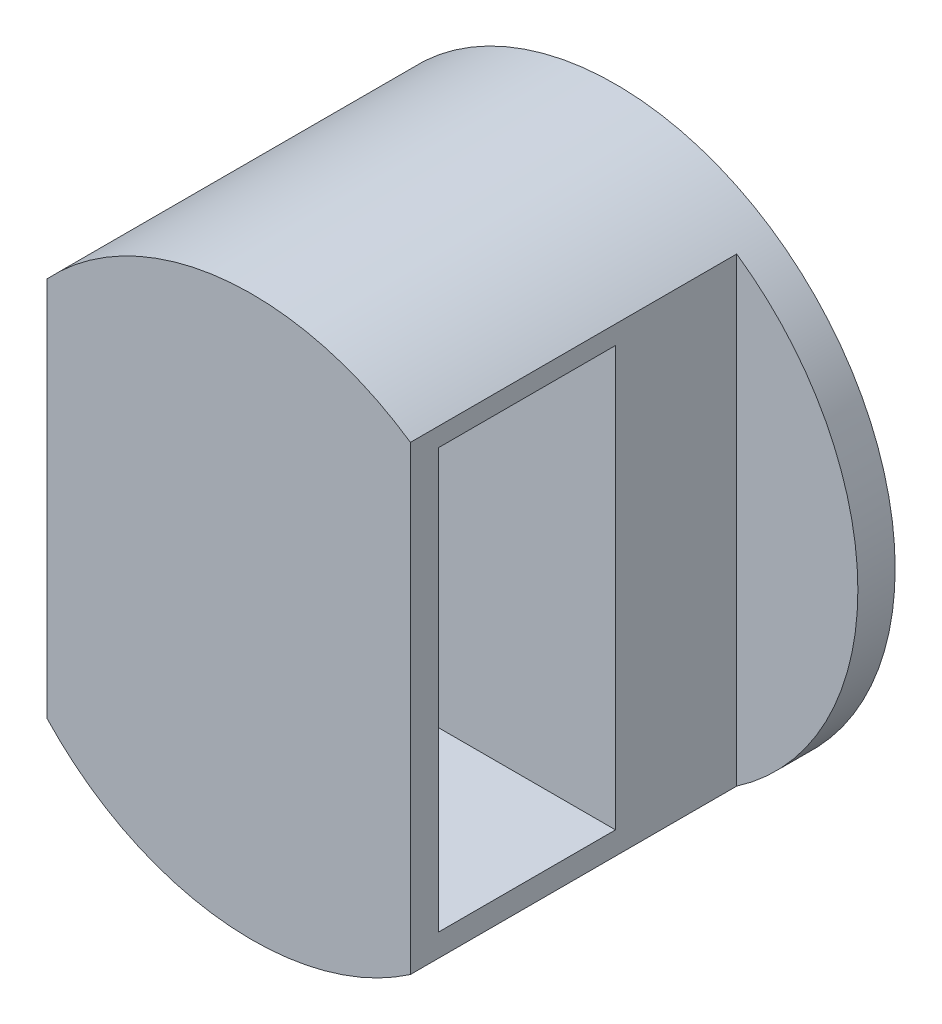
ISO-10303-21;
HEADER;
FILE_DESCRIPTION(('STEP AP214'),'2;1');
FILE_NAME('part.step','',(''),(''),'','','');
FILE_SCHEMA(('AUTOMOTIVE_DESIGN { 1 0 10303 214 1 1 1 1 }'));
ENDSEC;
DATA;
#1=APPLICATION_CONTEXT('core data for automotive mechanical design processes');
#2=APPLICATION_PROTOCOL_DEFINITION('international standard','automotive_design',2000,#1);
#3=PRODUCT_CONTEXT('',#1,'mechanical');
#4=PRODUCT('Part','Part','',(#3));
#5=PRODUCT_RELATED_PRODUCT_CATEGORY('part','',(#4));
#6=PRODUCT_DEFINITION_FORMATION('','',#4);
#7=PRODUCT_DEFINITION_CONTEXT('part definition',#1,'design');
#8=PRODUCT_DEFINITION('design','',#6,#7);
#9=PRODUCT_DEFINITION_SHAPE('','',#8);
#10=(LENGTH_UNIT() NAMED_UNIT(*) SI_UNIT(.MILLI.,.METRE.));
#11=(NAMED_UNIT(*) PLANE_ANGLE_UNIT() SI_UNIT($,.RADIAN.));
#12=(NAMED_UNIT(*) SI_UNIT($,.STERADIAN.) SOLID_ANGLE_UNIT());
#13=UNCERTAINTY_MEASURE_WITH_UNIT(LENGTH_MEASURE(1.E-05),#10,'distance_accuracy_value','');
#14=(GEOMETRIC_REPRESENTATION_CONTEXT(3) GLOBAL_UNCERTAINTY_ASSIGNED_CONTEXT((#13)) GLOBAL_UNIT_ASSIGNED_CONTEXT((#10,
#11,#12)) REPRESENTATION_CONTEXT('',''));
#15=CARTESIAN_POINT('',(0.,0.,0.));
#16=DIRECTION('',(0.,0.,1.));
#17=DIRECTION('',(1.,0.,0.));
#18=AXIS2_PLACEMENT_3D('',#15,#16,#17);
#19=CARTESIAN_POINT('',(-21.6771038039671,21.4882803297998,4.));
#20=DIRECTION('',(0.,0.,1.));
#21=DIRECTION('',(1.,0.,0.));
#22=AXIS2_PLACEMENT_3D('',#19,#20,#21);
#23=PLANE('',#22);
#24=CARTESIAN_POINT('',(-21.6771038039671,21.4882803297998,4.));
#25=DIRECTION('',(0.,0.,1.));
#26=DIRECTION('',(1.,0.,0.));
#27=AXIS2_PLACEMENT_3D('',#24,#25,#26);
#28=CIRCLE('',#27,30.);
#29=CARTESIAN_POINT('',(-43.6771038039671,41.8843583841709,4.));
#30=VERTEX_POINT('',#29);
#31=CARTESIAN_POINT('',(-43.6771038039671,1.09220227542863,4.));
#32=VERTEX_POINT('',#31);
#33=EDGE_CURVE('E11',#30,#32,#28,.T.);
#34=ORIENTED_EDGE('',*,*,#33,.T.);
#35=DIRECTION('',(0.,1.,0.));
#36=VECTOR('',#35,1.);
#37=CARTESIAN_POINT('',(-43.6771038039671,0.,4.));
#38=LINE('',#37,#36);
#39=EDGE_CURVE('E154',#32,#30,#38,.T.);
#40=ORIENTED_EDGE('',*,*,#39,.T.);
#41=EDGE_LOOP('',(#34,#40));
#42=FACE_BOUND('',#41,.T.);
#43=ADVANCED_FACE('F43',(#42),#23,.T.);
#44=CARTESIAN_POINT('',(-21.6771038039671,21.4882803297998,4.));
#45=DIRECTION('',(0.,0.,-1.));
#46=DIRECTION('',(-1.,0.,0.));
#47=AXIS2_PLACEMENT_3D('',#44,#45,#46);
#48=CYLINDRICAL_SURFACE('',#47,30.);
#49=ORIENTED_EDGE('',*,*,#33,.F.);
#50=DIRECTION('',(0.,0.,-1.));
#51=VECTOR('',#50,1.);
#52=CARTESIAN_POINT('',(-43.6771038039671,41.8843583841709,39.));
#53=LINE('',#52,#51);
#54=CARTESIAN_POINT('',(-43.6771038039671,41.8843583841709,39.));
#55=VERTEX_POINT('',#54);
#56=EDGE_CURVE('E165',#55,#30,#53,.T.);
#57=ORIENTED_EDGE('',*,*,#56,.F.);
#58=CARTESIAN_POINT('',(-21.6771038039671,21.4882803297998,39.));
#59=DIRECTION('',(0.,0.,1.));
#60=DIRECTION('',(1.,0.,0.));
#61=AXIS2_PLACEMENT_3D('',#58,#59,#60);
#62=CIRCLE('',#61,30.);
#63=CARTESIAN_POINT('',(-4.67710380396715,46.2066945184163,39.));
#64=VERTEX_POINT('',#63);
#65=EDGE_CURVE('E155',#64,#55,#62,.T.);
#66=ORIENTED_EDGE('',*,*,#65,.F.);
#67=DIRECTION('',(0.,0.,-1.));
#68=VECTOR('',#67,1.);
#69=CARTESIAN_POINT('',(-4.67710380396715,46.2066945184163,39.));
#70=LINE('',#69,#68);
#71=CARTESIAN_POINT('',(-4.67710380396715,46.2066945184163,4.));
#72=VERTEX_POINT('',#71);
#73=EDGE_CURVE('E168',#64,#72,#70,.T.);
#74=ORIENTED_EDGE('',*,*,#73,.T.);
#75=CARTESIAN_POINT('',(-4.67710380396714,-3.23013385881678,4.));
#76=VERTEX_POINT('',#75);
#77=EDGE_CURVE('E52',#76,#72,#28,.T.);
#78=ORIENTED_EDGE('',*,*,#77,.F.);
#79=DIRECTION('',(0.,0.,-1.));
#80=VECTOR('',#79,1.);
#81=CARTESIAN_POINT('',(-4.67710380396714,-3.23013385881678,39.));
#82=LINE('',#81,#80);
#83=CARTESIAN_POINT('',(-4.67710380396714,-3.23013385881678,39.));
#84=VERTEX_POINT('',#83);
#85=EDGE_CURVE('E171',#84,#76,#82,.T.);
#86=ORIENTED_EDGE('',*,*,#85,.F.);
#87=CARTESIAN_POINT('',(-43.6771038039671,1.09220227542863,39.));
#88=VERTEX_POINT('',#87);
#89=EDGE_CURVE('E150',#88,#84,#62,.T.);
#90=ORIENTED_EDGE('',*,*,#89,.F.);
#91=DIRECTION('',(0.,0.,-1.));
#92=VECTOR('',#91,1.);
#93=CARTESIAN_POINT('',(-43.6771038039671,1.09220227542863,39.));
#94=LINE('',#93,#92);
#95=EDGE_CURVE('E160',#88,#32,#94,.T.);
#96=ORIENTED_EDGE('',*,*,#95,.T.);
#97=EDGE_LOOP('',(#49,#57,#66,#74,#78,#86,#90,#96));
#98=FACE_BOUND('',#97,.T.);
#99=CARTESIAN_POINT('',(-21.6771038039671,21.4882803297998,0.));
#100=DIRECTION('',(0.,0.,1.));
#101=DIRECTION('',(1.,0.,0.));
#102=AXIS2_PLACEMENT_3D('',#99,#100,#101);
#103=CIRCLE('',#102,30.);
#104=CARTESIAN_POINT('',(8.32289619603285,21.4882803297998,0.));
#105=VERTEX_POINT('',#104);
#106=EDGE_CURVE('E47',#105,#105,#103,.T.);
#107=ORIENTED_EDGE('',*,*,#106,.T.);
#108=EDGE_LOOP('',(#107));
#109=FACE_BOUND('',#108,.T.);
#110=ADVANCED_FACE('F45',(#98,#109),#48,.T.);
#111=DIRECTION('',(0.,1.,0.));
#112=VECTOR('',#111,1.);
#113=CARTESIAN_POINT('',(-4.67710380396714,0.,4.));
#114=LINE('',#113,#112);
#115=EDGE_CURVE('E66',#76,#72,#114,.T.);
#116=ORIENTED_EDGE('',*,*,#115,.F.);
#117=ORIENTED_EDGE('',*,*,#77,.T.);
#118=EDGE_LOOP('',(#116,#117));
#119=FACE_BOUND('',#118,.T.);
#120=ADVANCED_FACE('F180',(#119),#23,.T.);
#121=CARTESIAN_POINT('',(-21.6771038039671,21.4882803297998,0.));
#122=DIRECTION('',(0.,0.,1.));
#123=DIRECTION('',(1.,0.,0.));
#124=AXIS2_PLACEMENT_3D('',#121,#122,#123);
#125=PLANE('',#124);
#126=CARTESIAN_POINT('',(-21.6771038039671,21.4882803297998,0.));
#127=DIRECTION('',(0.,0.,-1.));
#128=DIRECTION('',(-1.,0.,0.));
#129=AXIS2_PLACEMENT_3D('',#126,#127,#128);
#130=CIRCLE('',#129,1.00121044778746);
#131=CARTESIAN_POINT('',(-22.6783142517546,21.4882803297998,0.));
#132=VERTEX_POINT('',#131);
#133=EDGE_CURVE('E134',#132,#132,#130,.T.);
#134=ORIENTED_EDGE('',*,*,#133,.F.);
#135=EDGE_LOOP('',(#134));
#136=FACE_BOUND('',#135,.T.);
#137=ORIENTED_EDGE('',*,*,#106,.F.);
#138=EDGE_LOOP('',(#137));
#139=FACE_BOUND('',#138,.T.);
#140=ADVANCED_FACE('F177',(#136,#139),#125,.F.);
#141=CARTESIAN_POINT('',(-4.67710380396714,0.,39.));
#142=DIRECTION('',(-1.,0.,0.));
#143=DIRECTION('',(0.,-1.,0.));
#144=AXIS2_PLACEMENT_3D('',#141,#142,#143);
#145=PLANE('',#144);
#146=DIRECTION('',(0.,0.,-1.));
#147=VECTOR('',#146,1.);
#148=CARTESIAN_POINT('',(-4.67710380396714,-0.793305481583684,36.));
#149=LINE('',#148,#147);
#150=CARTESIAN_POINT('',(-4.67710380396714,-0.793305481583684,36.));
#151=VERTEX_POINT('',#150);
#152=CARTESIAN_POINT('',(-4.67710380396714,-0.793305481583684,17.));
#153=VERTEX_POINT('',#152);
#154=EDGE_CURVE('E140',#151,#153,#149,.T.);
#155=ORIENTED_EDGE('',*,*,#154,.F.);
#156=DIRECTION('',(0.,-1.,0.));
#157=VECTOR('',#156,1.);
#158=CARTESIAN_POINT('',(-4.67710380396715,44.2066945184163,36.));
#159=LINE('',#158,#157);
#160=CARTESIAN_POINT('',(-4.67710380396715,44.2066945184163,36.));
#161=VERTEX_POINT('',#160);
#162=EDGE_CURVE('E59',#161,#151,#159,.T.);
#163=ORIENTED_EDGE('',*,*,#162,.F.);
#164=DIRECTION('',(0.,0.,1.));
#165=VECTOR('',#164,1.);
#166=CARTESIAN_POINT('',(-4.67710380396715,44.2066945184163,36.));
#167=LINE('',#166,#165);
#168=CARTESIAN_POINT('',(-4.67710380396715,44.2066945184163,17.));
#169=VERTEX_POINT('',#168);
#170=EDGE_CURVE('E128',#169,#161,#167,.T.);
#171=ORIENTED_EDGE('',*,*,#170,.F.);
#172=DIRECTION('',(0.,1.,0.));
#173=VECTOR('',#172,1.);
#174=CARTESIAN_POINT('',(-4.67710380396715,44.2066945184163,17.));
#175=LINE('',#174,#173);
#176=EDGE_CURVE('E131',#153,#169,#175,.T.);
#177=ORIENTED_EDGE('',*,*,#176,.F.);
#178=EDGE_LOOP('',(#155,#163,#171,#177));
#179=FACE_BOUND('',#178,.T.);
#180=ORIENTED_EDGE('',*,*,#115,.T.);
#181=ORIENTED_EDGE('',*,*,#73,.F.);
#182=DIRECTION('',(0.,1.,0.));
#183=VECTOR('',#182,1.);
#184=CARTESIAN_POINT('',(-4.67710380396714,0.,39.));
#185=LINE('',#184,#183);
#186=EDGE_CURVE('E153',#84,#64,#185,.T.);
#187=ORIENTED_EDGE('',*,*,#186,.F.);
#188=ORIENTED_EDGE('',*,*,#85,.T.);
#189=EDGE_LOOP('',(#180,#181,#187,#188));
#190=FACE_BOUND('',#189,.T.);
#191=ADVANCED_FACE('F179',(#179,#190),#145,.F.);
#192=CARTESIAN_POINT('',(-43.6771038039671,0.,39.));
#193=DIRECTION('',(-1.,0.,0.));
#194=DIRECTION('',(0.,0.,1.));
#195=AXIS2_PLACEMENT_3D('',#192,#193,#194);
#196=PLANE('',#195);
#197=ORIENTED_EDGE('',*,*,#39,.F.);
#198=ORIENTED_EDGE('',*,*,#95,.F.);
#199=DIRECTION('',(0.,1.,0.));
#200=VECTOR('',#199,1.);
#201=CARTESIAN_POINT('',(-43.6771038039671,0.,39.));
#202=LINE('',#201,#200);
#203=EDGE_CURVE('E157',#88,#55,#202,.T.);
#204=ORIENTED_EDGE('',*,*,#203,.T.);
#205=ORIENTED_EDGE('',*,*,#56,.T.);
#206=EDGE_LOOP('',(#197,#198,#204,#205));
#207=FACE_BOUND('',#206,.T.);
#208=ADVANCED_FACE('F187',(#207),#196,.T.);
#209=CARTESIAN_POINT('',(0.,0.,39.));
#210=DIRECTION('',(0.,0.,1.));
#211=DIRECTION('',(1.,0.,0.));
#212=AXIS2_PLACEMENT_3D('',#209,#210,#211);
#213=PLANE('',#212);
#214=ORIENTED_EDGE('',*,*,#89,.T.);
#215=ORIENTED_EDGE('',*,*,#186,.T.);
#216=ORIENTED_EDGE('',*,*,#65,.T.);
#217=ORIENTED_EDGE('',*,*,#203,.F.);
#218=EDGE_LOOP('',(#214,#215,#216,#217));
#219=FACE_BOUND('',#218,.T.);
#220=ADVANCED_FACE('F202',(#219),#213,.T.);
#221=CARTESIAN_POINT('',(-34.6771038039671,44.2066945184163,36.));
#222=DIRECTION('',(0.,0.,1.));
#223=DIRECTION('',(0.,-1.,0.));
#224=AXIS2_PLACEMENT_3D('',#221,#222,#223);
#225=PLANE('',#224);
#226=ORIENTED_EDGE('',*,*,#162,.T.);
#227=DIRECTION('',(1.,0.,0.));
#228=VECTOR('',#227,1.);
#229=CARTESIAN_POINT('',(-34.6771038039671,-0.793305481583685,36.));
#230=LINE('',#229,#228);
#231=CARTESIAN_POINT('',(-34.6771038039671,-0.793305481583685,36.));
#232=VERTEX_POINT('',#231);
#233=EDGE_CURVE('E106',#232,#151,#230,.T.);
#234=ORIENTED_EDGE('',*,*,#233,.F.);
#235=DIRECTION('',(0.,-1.,0.));
#236=VECTOR('',#235,1.);
#237=CARTESIAN_POINT('',(-34.6771038039671,44.2066945184163,36.));
#238=LINE('',#237,#236);
#239=CARTESIAN_POINT('',(-34.6771038039671,44.2066945184163,36.));
#240=VERTEX_POINT('',#239);
#241=EDGE_CURVE('E110',#240,#232,#238,.T.);
#242=ORIENTED_EDGE('',*,*,#241,.F.);
#243=DIRECTION('',(1.,0.,0.));
#244=VECTOR('',#243,1.);
#245=CARTESIAN_POINT('',(-34.6771038039671,44.2066945184163,36.));
#246=LINE('',#245,#244);
#247=EDGE_CURVE('E145',#240,#161,#246,.T.);
#248=ORIENTED_EDGE('',*,*,#247,.T.);
#249=EDGE_LOOP('',(#226,#234,#242,#248));
#250=FACE_BOUND('',#249,.T.);
#251=ADVANCED_FACE('F108',(#250),#225,.F.);
#252=CARTESIAN_POINT('',(-34.6771038039671,44.2066945184163,36.));
#253=DIRECTION('',(0.,1.,0.));
#254=DIRECTION('',(-1.,0.,0.));
#255=AXIS2_PLACEMENT_3D('',#252,#253,#254);
#256=PLANE('',#255);
#257=ORIENTED_EDGE('',*,*,#170,.T.);
#258=ORIENTED_EDGE('',*,*,#247,.F.);
#259=DIRECTION('',(0.,0.,1.));
#260=VECTOR('',#259,1.);
#261=CARTESIAN_POINT('',(-34.6771038039671,44.2066945184163,36.));
#262=LINE('',#261,#260);
#263=CARTESIAN_POINT('',(-34.6771038039671,44.2066945184163,17.));
#264=VERTEX_POINT('',#263);
#265=EDGE_CURVE('E116',#264,#240,#262,.T.);
#266=ORIENTED_EDGE('',*,*,#265,.F.);
#267=DIRECTION('',(1.,0.,0.));
#268=VECTOR('',#267,1.);
#269=CARTESIAN_POINT('',(-34.6771038039671,44.2066945184163,17.));
#270=LINE('',#269,#268);
#271=EDGE_CURVE('E147',#264,#169,#270,.T.);
#272=ORIENTED_EDGE('',*,*,#271,.T.);
#273=EDGE_LOOP('',(#257,#258,#266,#272));
#274=FACE_BOUND('',#273,.T.);
#275=ADVANCED_FACE('F209',(#274),#256,.F.);
#276=CARTESIAN_POINT('',(-34.6771038039671,44.2066945184163,17.));
#277=DIRECTION('',(0.,0.,-1.));
#278=DIRECTION('',(0.,1.,0.));
#279=AXIS2_PLACEMENT_3D('',#276,#277,#278);
#280=PLANE('',#279);
#281=ORIENTED_EDGE('',*,*,#176,.T.);
#282=ORIENTED_EDGE('',*,*,#271,.F.);
#283=DIRECTION('',(0.,1.,0.));
#284=VECTOR('',#283,1.);
#285=CARTESIAN_POINT('',(-34.6771038039671,44.2066945184163,17.));
#286=LINE('',#285,#284);
#287=CARTESIAN_POINT('',(-34.6771038039671,-0.793305481583685,17.));
#288=VERTEX_POINT('',#287);
#289=EDGE_CURVE('E124',#288,#264,#286,.T.);
#290=ORIENTED_EDGE('',*,*,#289,.F.);
#291=DIRECTION('',(1.,0.,0.));
#292=VECTOR('',#291,1.);
#293=CARTESIAN_POINT('',(-34.6771038039671,-0.793305481583685,17.));
#294=LINE('',#293,#292);
#295=EDGE_CURVE('E115',#288,#153,#294,.T.);
#296=ORIENTED_EDGE('',*,*,#295,.T.);
#297=EDGE_LOOP('',(#281,#282,#290,#296));
#298=FACE_BOUND('',#297,.T.);
#299=ADVANCED_FACE('F212',(#298),#280,.F.);
#300=CARTESIAN_POINT('',(-34.6771038039671,-0.793305481583685,36.));
#301=DIRECTION('',(0.,-1.,0.));
#302=DIRECTION('',(1.,0.,0.));
#303=AXIS2_PLACEMENT_3D('',#300,#301,#302);
#304=PLANE('',#303);
#305=ORIENTED_EDGE('',*,*,#154,.T.);
#306=ORIENTED_EDGE('',*,*,#295,.F.);
#307=DIRECTION('',(0.,0.,-1.));
#308=VECTOR('',#307,1.);
#309=CARTESIAN_POINT('',(-34.6771038039671,-0.793305481583685,36.));
#310=LINE('',#309,#308);
#311=EDGE_CURVE('E119',#232,#288,#310,.T.);
#312=ORIENTED_EDGE('',*,*,#311,.F.);
#313=ORIENTED_EDGE('',*,*,#233,.T.);
#314=EDGE_LOOP('',(#305,#306,#312,#313));
#315=FACE_BOUND('',#314,.T.);
#316=ADVANCED_FACE('F120',(#315),#304,.F.);
#317=CARTESIAN_POINT('',(-34.6771038039671,0.,0.));
#318=DIRECTION('',(1.,0.,0.));
#319=DIRECTION('',(0.,1.,0.));
#320=AXIS2_PLACEMENT_3D('',#317,#318,#319);
#321=PLANE('',#320);
#322=ORIENTED_EDGE('',*,*,#241,.T.);
#323=ORIENTED_EDGE('',*,*,#311,.T.);
#324=ORIENTED_EDGE('',*,*,#289,.T.);
#325=ORIENTED_EDGE('',*,*,#265,.T.);
#326=EDGE_LOOP('',(#322,#323,#324,#325));
#327=FACE_BOUND('',#326,.T.);
#328=ADVANCED_FACE('F126',(#327),#321,.T.);
#329=CARTESIAN_POINT('',(-21.6771038039671,21.4882803297998,1.99999999999998));
#330=DIRECTION('',(0.,0.,-1.));
#331=DIRECTION('',(-1.,0.,0.));
#332=AXIS2_PLACEMENT_3D('',#329,#330,#331);
#333=CYLINDRICAL_SURFACE('',#332,1.00121044778746);
#334=CARTESIAN_POINT('',(-21.6771038039671,21.4882803297998,1.99999999999998));
#335=DIRECTION('',(0.,0.,-1.));
#336=DIRECTION('',(-1.,0.,0.));
#337=AXIS2_PLACEMENT_3D('',#334,#335,#336);
#338=CIRCLE('',#337,1.00121044778746);
#339=CARTESIAN_POINT('',(-22.6783142517546,21.4882803297998,1.99999999999998));
#340=VERTEX_POINT('',#339);
#341=EDGE_CURVE('E141',#340,#340,#338,.T.);
#342=ORIENTED_EDGE('',*,*,#341,.F.);
#343=EDGE_LOOP('',(#342));
#344=FACE_BOUND('',#343,.T.);
#345=ORIENTED_EDGE('',*,*,#133,.T.);
#346=EDGE_LOOP('',(#345));
#347=FACE_BOUND('',#346,.T.);
#348=ADVANCED_FACE('F220',(#344,#347),#333,.F.);
#349=CARTESIAN_POINT('',(-21.6771038039671,21.4882803297998,1.99999999999998));
#350=DIRECTION('',(0.,0.,-1.));
#351=DIRECTION('',(-1.,0.,0.));
#352=AXIS2_PLACEMENT_3D('',#349,#350,#351);
#353=PLANE('',#352);
#354=ORIENTED_EDGE('',*,*,#341,.T.);
#355=EDGE_LOOP('',(#354));
#356=FACE_BOUND('',#355,.T.);
#357=ADVANCED_FACE('F222',(#356),#353,.T.);
#358=CLOSED_SHELL('',(#43,#110,#120,#140,#191,#208,#220,#251,#275,#299,#316,#328,#348,#357));
#359=MANIFOLD_SOLID_BREP('B2',#358);
#360=ADVANCED_BREP_SHAPE_REPRESENTATION('',(#18,#359),#14);
#361=SHAPE_DEFINITION_REPRESENTATION(#9,#360);
ENDSEC;
END-ISO-10303-21;
